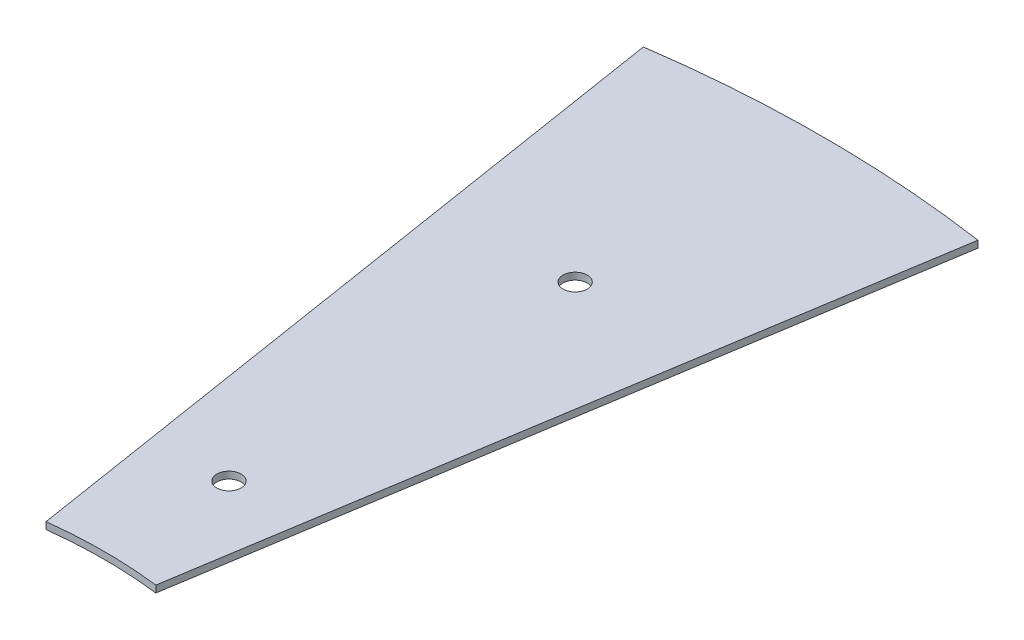
ISO-10303-21;
HEADER;
FILE_DESCRIPTION(('STEP AP214'),'2;1');
FILE_NAME('part.step','',(''),(''),'','','');
FILE_SCHEMA(('AUTOMOTIVE_DESIGN { 1 0 10303 214 1 1 1 1 }'));
ENDSEC;
DATA;
#1=APPLICATION_CONTEXT('core data for automotive mechanical design processes');
#2=APPLICATION_PROTOCOL_DEFINITION('international standard','automotive_design',2000,#1);
#3=PRODUCT_CONTEXT('',#1,'mechanical');
#4=PRODUCT('Part','Part','',(#3));
#5=PRODUCT_RELATED_PRODUCT_CATEGORY('part','',(#4));
#6=PRODUCT_DEFINITION_FORMATION('','',#4);
#7=PRODUCT_DEFINITION_CONTEXT('part definition',#1,'design');
#8=PRODUCT_DEFINITION('design','',#6,#7);
#9=PRODUCT_DEFINITION_SHAPE('','',#8);
#10=(LENGTH_UNIT() NAMED_UNIT(*) SI_UNIT(.MILLI.,.METRE.));
#11=(NAMED_UNIT(*) PLANE_ANGLE_UNIT() SI_UNIT($,.RADIAN.));
#12=(NAMED_UNIT(*) SI_UNIT($,.STERADIAN.) SOLID_ANGLE_UNIT());
#13=UNCERTAINTY_MEASURE_WITH_UNIT(LENGTH_MEASURE(1.E-05),#10,'distance_accuracy_value','');
#14=(GEOMETRIC_REPRESENTATION_CONTEXT(3) GLOBAL_UNCERTAINTY_ASSIGNED_CONTEXT((#13)) GLOBAL_UNIT_ASSIGNED_CONTEXT((#10,
#11,#12)) REPRESENTATION_CONTEXT('',''));
#15=CARTESIAN_POINT('',(0.,0.,0.));
#16=DIRECTION('',(0.,0.,1.));
#17=DIRECTION('',(1.,0.,0.));
#18=AXIS2_PLACEMENT_3D('',#15,#16,#17);
#19=CARTESIAN_POINT('',(0.,1.,0.));
#20=DIRECTION('',(0.,-1.,0.));
#21=DIRECTION('',(0.,0.,-1.));
#22=AXIS2_PLACEMENT_3D('',#19,#20,#21);
#23=CYLINDRICAL_SURFACE('',#22,169.);
#24=CARTESIAN_POINT('',(0.,0.,0.));
#25=DIRECTION('',(0.,1.,0.));
#26=DIRECTION('',(0.,0.,-1.));
#27=AXIS2_PLACEMENT_3D('',#24,#25,#26);
#28=CIRCLE('',#27,169.);
#29=CARTESIAN_POINT('',(24.2223266800083,0.,-167.255131132671));
#30=VERTEX_POINT('',#29);
#31=CARTESIAN_POINT('',(-24.2223266800083,0.,-167.255131132671));
#32=VERTEX_POINT('',#31);
#33=EDGE_CURVE('E112',#30,#32,#28,.T.);
#34=ORIENTED_EDGE('',*,*,#33,.T.);
#35=DIRECTION('',(0.,-1.,0.));
#36=VECTOR('',#35,1.);
#37=CARTESIAN_POINT('',(-24.2223266800083,1.,-167.255131132671));
#38=LINE('',#37,#36);
#39=CARTESIAN_POINT('',(-24.2223266800083,1.,-167.255131132671));
#40=VERTEX_POINT('',#39);
#41=EDGE_CURVE('E11',#40,#32,#38,.T.);
#42=ORIENTED_EDGE('',*,*,#41,.F.);
#43=CARTESIAN_POINT('',(0.,1.,0.));
#44=DIRECTION('',(0.,1.,0.));
#45=DIRECTION('',(0.,0.,-1.));
#46=AXIS2_PLACEMENT_3D('',#43,#44,#45);
#47=CIRCLE('',#46,169.);
#48=CARTESIAN_POINT('',(24.2223266800083,1.,-167.255131132671));
#49=VERTEX_POINT('',#48);
#50=EDGE_CURVE('E94',#49,#40,#47,.T.);
#51=ORIENTED_EDGE('',*,*,#50,.F.);
#52=DIRECTION('',(0.,-1.,0.));
#53=VECTOR('',#52,1.);
#54=CARTESIAN_POINT('',(24.2223266800083,1.,-167.255131132671));
#55=LINE('',#54,#53);
#56=EDGE_CURVE('E108',#49,#30,#55,.T.);
#57=ORIENTED_EDGE('',*,*,#56,.T.);
#58=EDGE_LOOP('',(#34,#42,#51,#57));
#59=FACE_BOUND('',#58,.T.);
#60=ADVANCED_FACE('F39',(#59),#23,.T.);
#61=CARTESIAN_POINT('',(-24.2223266800083,1.,-167.255131132671));
#62=DIRECTION('',(0.987688340595138,0.,-0.156434465040231));
#63=DIRECTION('',(-0.156434465040231,0.,-0.987688340595138));
#64=AXIS2_PLACEMENT_3D('',#61,#62,#63);
#65=PLANE('',#64);
#66=DIRECTION('',(0.156434465040231,0.,0.987688340595138));
#67=VECTOR('',#66,1.);
#68=CARTESIAN_POINT('',(-24.2223266800083,0.,-167.255131132671));
#69=LINE('',#68,#67);
#70=CARTESIAN_POINT('',(-7.9494238135163,0.,-64.5120660111975));
#71=VERTEX_POINT('',#70);
#72=EDGE_CURVE('E99',#32,#71,#69,.T.);
#73=ORIENTED_EDGE('',*,*,#72,.T.);
#74=DIRECTION('',(0.,-1.,0.));
#75=VECTOR('',#74,1.);
#76=CARTESIAN_POINT('',(-7.9494238135163,1.,-64.5120660111975));
#77=LINE('',#76,#75);
#78=CARTESIAN_POINT('',(-7.9494238135163,1.,-64.5120660111975));
#79=VERTEX_POINT('',#78);
#80=EDGE_CURVE('E47',#79,#71,#77,.T.);
#81=ORIENTED_EDGE('',*,*,#80,.F.);
#82=DIRECTION('',(0.156434465040231,0.,0.987688340595138));
#83=VECTOR('',#82,1.);
#84=CARTESIAN_POINT('',(-24.2223266800083,1.,-167.255131132671));
#85=LINE('',#84,#83);
#86=EDGE_CURVE('E88',#40,#79,#85,.T.);
#87=ORIENTED_EDGE('',*,*,#86,.F.);
#88=ORIENTED_EDGE('',*,*,#41,.T.);
#89=EDGE_LOOP('',(#73,#81,#87,#88));
#90=FACE_BOUND('',#89,.T.);
#91=ADVANCED_FACE('F98',(#90),#65,.F.);
#92=CARTESIAN_POINT('',(0.,1.,0.));
#93=DIRECTION('',(0.,-1.,0.));
#94=DIRECTION('',(0.,0.,-1.));
#95=AXIS2_PLACEMENT_3D('',#92,#93,#94);
#96=CYLINDRICAL_SURFACE('',#95,65.);
#97=CARTESIAN_POINT('',(0.,0.,0.));
#98=DIRECTION('',(0.,-1.,0.));
#99=DIRECTION('',(0.,0.,-1.));
#100=AXIS2_PLACEMENT_3D('',#97,#98,#99);
#101=CIRCLE('',#100,65.);
#102=CARTESIAN_POINT('',(7.94942381351633,0.,-64.5120660111975));
#103=VERTEX_POINT('',#102);
#104=EDGE_CURVE('E75',#71,#103,#101,.T.);
#105=ORIENTED_EDGE('',*,*,#104,.T.);
#106=DIRECTION('',(0.,-1.,0.));
#107=VECTOR('',#106,1.);
#108=CARTESIAN_POINT('',(7.94942381351633,1.,-64.5120660111975));
#109=LINE('',#108,#107);
#110=CARTESIAN_POINT('',(7.94942381351633,1.,-64.5120660111975));
#111=VERTEX_POINT('',#110);
#112=EDGE_CURVE('E101',#111,#103,#109,.T.);
#113=ORIENTED_EDGE('',*,*,#112,.F.);
#114=CARTESIAN_POINT('',(0.,1.,0.));
#115=DIRECTION('',(0.,-1.,0.));
#116=DIRECTION('',(0.,0.,-1.));
#117=AXIS2_PLACEMENT_3D('',#114,#115,#116);
#118=CIRCLE('',#117,65.);
#119=EDGE_CURVE('E92',#79,#111,#118,.T.);
#120=ORIENTED_EDGE('',*,*,#119,.F.);
#121=ORIENTED_EDGE('',*,*,#80,.T.);
#122=EDGE_LOOP('',(#105,#113,#120,#121));
#123=FACE_BOUND('',#122,.T.);
#124=ADVANCED_FACE('F102',(#123),#96,.F.);
#125=CARTESIAN_POINT('',(24.2223266800083,1.,-167.255131132671));
#126=DIRECTION('',(-0.987688340595138,0.,-0.156434465040231));
#127=DIRECTION('',(-0.156434465040231,0.,0.987688340595138));
#128=AXIS2_PLACEMENT_3D('',#125,#126,#127);
#129=PLANE('',#128);
#130=DIRECTION('',(0.156434465040231,0.,-0.987688340595138));
#131=VECTOR('',#130,1.);
#132=CARTESIAN_POINT('',(24.2223266800083,0.,-167.255131132671));
#133=LINE('',#132,#131);
#134=EDGE_CURVE('E81',#103,#30,#133,.T.);
#135=ORIENTED_EDGE('',*,*,#134,.T.);
#136=ORIENTED_EDGE('',*,*,#56,.F.);
#137=DIRECTION('',(0.156434465040231,0.,-0.987688340595138));
#138=VECTOR('',#137,1.);
#139=CARTESIAN_POINT('',(24.2223266800083,1.,-167.255131132671));
#140=LINE('',#139,#138);
#141=EDGE_CURVE('E55',#111,#49,#140,.T.);
#142=ORIENTED_EDGE('',*,*,#141,.F.);
#143=ORIENTED_EDGE('',*,*,#112,.T.);
#144=EDGE_LOOP('',(#135,#136,#142,#143));
#145=FACE_BOUND('',#144,.T.);
#146=ADVANCED_FACE('F123',(#145),#129,.F.);
#147=CARTESIAN_POINT('',(0.,1.,0.));
#148=DIRECTION('',(0.,-1.,0.));
#149=DIRECTION('',(0.,0.,-1.));
#150=AXIS2_PLACEMENT_3D('',#147,#148,#149);
#151=PLANE('',#150);
#152=CARTESIAN_POINT('',(0.315646262662579,1.,-132.845084609384));
#153=DIRECTION('',(0.,-1.,0.));
#154=DIRECTION('',(0.,0.,-1.));
#155=AXIS2_PLACEMENT_3D('',#152,#153,#154);
#156=CIRCLE('',#155,1.75500000000001);
#157=CARTESIAN_POINT('',(0.315646262662579,1.,-134.600084609384));
#158=VERTEX_POINT('',#157);
#159=EDGE_CURVE('E132',#158,#158,#156,.T.);
#160=ORIENTED_EDGE('',*,*,#159,.T.);
#161=EDGE_LOOP('',(#160));
#162=FACE_BOUND('',#161,.T.);
#163=CARTESIAN_POINT('',(0.196844211164931,1.,-82.845225748858));
#164=DIRECTION('',(0.,-1.,0.));
#165=DIRECTION('',(0.,0.,-1.));
#166=AXIS2_PLACEMENT_3D('',#163,#164,#165);
#167=CIRCLE('',#166,1.755);
#168=CARTESIAN_POINT('',(0.196844211164931,1.,-84.600225748858));
#169=VERTEX_POINT('',#168);
#170=EDGE_CURVE('E115',#169,#169,#167,.T.);
#171=ORIENTED_EDGE('',*,*,#170,.T.);
#172=EDGE_LOOP('',(#171));
#173=FACE_BOUND('',#172,.T.);
#174=ORIENTED_EDGE('',*,*,#50,.T.);
#175=ORIENTED_EDGE('',*,*,#86,.T.);
#176=ORIENTED_EDGE('',*,*,#119,.T.);
#177=ORIENTED_EDGE('',*,*,#141,.T.);
#178=EDGE_LOOP('',(#174,#175,#176,#177));
#179=FACE_BOUND('',#178,.T.);
#180=ADVANCED_FACE('F90',(#162,#173,#179),#151,.F.);
#181=CARTESIAN_POINT('',(0.,0.,0.));
#182=DIRECTION('',(0.,-1.,0.));
#183=DIRECTION('',(0.,0.,-1.));
#184=AXIS2_PLACEMENT_3D('',#181,#182,#183);
#185=PLANE('',#184);
#186=CARTESIAN_POINT('',(0.315646262662579,0.,-132.845084609384));
#187=DIRECTION('',(0.,-1.,0.));
#188=DIRECTION('',(0.,0.,-1.));
#189=AXIS2_PLACEMENT_3D('',#186,#187,#188);
#190=CIRCLE('',#189,1.75500000000001);
#191=CARTESIAN_POINT('',(0.315646262662579,0.,-134.600084609384));
#192=VERTEX_POINT('',#191);
#193=EDGE_CURVE('E136',#192,#192,#190,.T.);
#194=ORIENTED_EDGE('',*,*,#193,.F.);
#195=EDGE_LOOP('',(#194));
#196=FACE_BOUND('',#195,.T.);
#197=CARTESIAN_POINT('',(0.196844211164931,0.,-82.845225748858));
#198=DIRECTION('',(0.,-1.,0.));
#199=DIRECTION('',(0.,0.,-1.));
#200=AXIS2_PLACEMENT_3D('',#197,#198,#199);
#201=CIRCLE('',#200,1.755);
#202=CARTESIAN_POINT('',(0.196844211164931,0.,-84.600225748858));
#203=VERTEX_POINT('',#202);
#204=EDGE_CURVE('E129',#203,#203,#201,.T.);
#205=ORIENTED_EDGE('',*,*,#204,.F.);
#206=EDGE_LOOP('',(#205));
#207=FACE_BOUND('',#206,.T.);
#208=ORIENTED_EDGE('',*,*,#33,.F.);
#209=ORIENTED_EDGE('',*,*,#134,.F.);
#210=ORIENTED_EDGE('',*,*,#104,.F.);
#211=ORIENTED_EDGE('',*,*,#72,.F.);
#212=EDGE_LOOP('',(#208,#209,#210,#211));
#213=FACE_BOUND('',#212,.T.);
#214=ADVANCED_FACE('F126',(#196,#207,#213),#185,.T.);
#215=CARTESIAN_POINT('',(0.196844211164931,1.,-82.845225748858));
#216=DIRECTION('',(0.,-1.,0.));
#217=DIRECTION('',(0.,0.,-1.));
#218=AXIS2_PLACEMENT_3D('',#215,#216,#217);
#219=CYLINDRICAL_SURFACE('',#218,1.755);
#220=ORIENTED_EDGE('',*,*,#170,.F.);
#221=EDGE_LOOP('',(#220));
#222=FACE_BOUND('',#221,.T.);
#223=ORIENTED_EDGE('',*,*,#204,.T.);
#224=EDGE_LOOP('',(#223));
#225=FACE_BOUND('',#224,.T.);
#226=ADVANCED_FACE('F149',(#222,#225),#219,.F.);
#227=CARTESIAN_POINT('',(0.315646262662579,1.,-132.845084609384));
#228=DIRECTION('',(0.,-1.,0.));
#229=DIRECTION('',(0.,0.,-1.));
#230=AXIS2_PLACEMENT_3D('',#227,#228,#229);
#231=CYLINDRICAL_SURFACE('',#230,1.75500000000001);
#232=ORIENTED_EDGE('',*,*,#159,.F.);
#233=EDGE_LOOP('',(#232));
#234=FACE_BOUND('',#233,.T.);
#235=ORIENTED_EDGE('',*,*,#193,.T.);
#236=EDGE_LOOP('',(#235));
#237=FACE_BOUND('',#236,.T.);
#238=ADVANCED_FACE('F146',(#234,#237),#231,.F.);
#239=CLOSED_SHELL('',(#60,#91,#124,#146,#180,#214,#226,#238));
#240=MANIFOLD_SOLID_BREP('B2',#239);
#241=ADVANCED_BREP_SHAPE_REPRESENTATION('',(#18,#240),#14);
#242=SHAPE_DEFINITION_REPRESENTATION(#9,#241);
ENDSEC;
END-ISO-10303-21;
